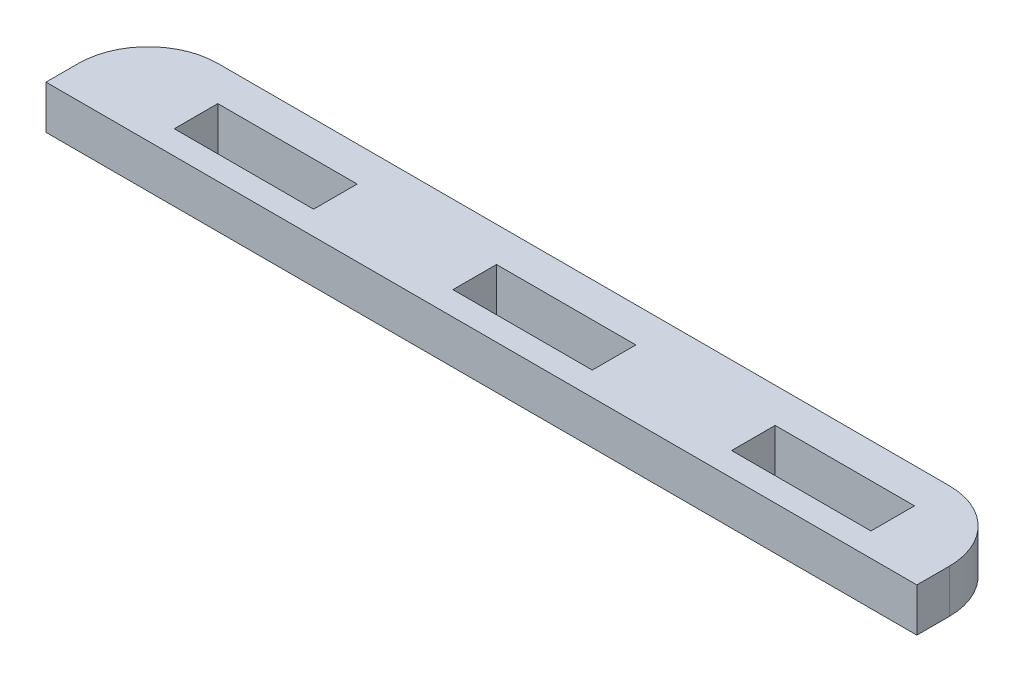
ISO-10303-21;
HEADER;
FILE_DESCRIPTION(('STEP AP214'),'2;1');
FILE_NAME('part.step','',(''),(''),'','','');
FILE_SCHEMA(('AUTOMOTIVE_DESIGN { 1 0 10303 214 1 1 1 1 }'));
ENDSEC;
DATA;
#1=APPLICATION_CONTEXT('core data for automotive mechanical design processes');
#2=APPLICATION_PROTOCOL_DEFINITION('international standard','automotive_design',2000,#1);
#3=PRODUCT_CONTEXT('',#1,'mechanical');
#4=PRODUCT('Part','Part','',(#3));
#5=PRODUCT_RELATED_PRODUCT_CATEGORY('part','',(#4));
#6=PRODUCT_DEFINITION_FORMATION('','',#4);
#7=PRODUCT_DEFINITION_CONTEXT('part definition',#1,'design');
#8=PRODUCT_DEFINITION('design','',#6,#7);
#9=PRODUCT_DEFINITION_SHAPE('','',#8);
#10=(LENGTH_UNIT() NAMED_UNIT(*) SI_UNIT(.MILLI.,.METRE.));
#11=(NAMED_UNIT(*) PLANE_ANGLE_UNIT() SI_UNIT($,.RADIAN.));
#12=(NAMED_UNIT(*) SI_UNIT($,.STERADIAN.) SOLID_ANGLE_UNIT());
#13=UNCERTAINTY_MEASURE_WITH_UNIT(LENGTH_MEASURE(1.E-05),#10,'distance_accuracy_value','');
#14=(GEOMETRIC_REPRESENTATION_CONTEXT(3) GLOBAL_UNCERTAINTY_ASSIGNED_CONTEXT((#13)) GLOBAL_UNIT_ASSIGNED_CONTEXT((#10,
#11,#12)) REPRESENTATION_CONTEXT('',''));
#15=CARTESIAN_POINT('',(0.,0.,0.));
#16=DIRECTION('',(0.,0.,1.));
#17=DIRECTION('',(1.,0.,0.));
#18=AXIS2_PLACEMENT_3D('',#15,#16,#17);
#19=CARTESIAN_POINT('',(31.75,3.175,15.113));
#20=DIRECTION('',(0.,-1.,0.));
#21=DIRECTION('',(0.,0.,-1.));
#22=AXIS2_PLACEMENT_3D('',#19,#20,#21);
#23=PLANE('',#22);
#24=DIRECTION('',(0.,0.,1.));
#25=VECTOR('',#24,1.);
#26=CARTESIAN_POINT('',(-24.13,3.175,-15.7479999999997));
#27=LINE('',#26,#25);
#28=CARTESIAN_POINT('',(-24.13,3.175,-15.7479999999997));
#29=VERTEX_POINT('',#28);
#30=CARTESIAN_POINT('',(-24.13,3.175,-12.5729999999997));
#31=VERTEX_POINT('',#30);
#32=EDGE_CURVE('E221',#29,#31,#27,.T.);
#33=ORIENTED_EDGE('',*,*,#32,.F.);
#34=DIRECTION('',(-1.,0.,0.));
#35=VECTOR('',#34,1.);
#36=CARTESIAN_POINT('',(-13.97,3.175,-15.7479999999997));
#37=LINE('',#36,#35);
#38=CARTESIAN_POINT('',(-13.97,3.175,-15.7479999999997));
#39=VERTEX_POINT('',#38);
#40=EDGE_CURVE('E229',#39,#29,#37,.T.);
#41=ORIENTED_EDGE('',*,*,#40,.F.);
#42=DIRECTION('',(0.,0.,-1.));
#43=VECTOR('',#42,1.);
#44=CARTESIAN_POINT('',(-13.97,3.175,-15.7479999999997));
#45=LINE('',#44,#43);
#46=CARTESIAN_POINT('',(-13.97,3.175,-12.5729999999997));
#47=VERTEX_POINT('',#46);
#48=EDGE_CURVE('E226',#47,#39,#45,.T.);
#49=ORIENTED_EDGE('',*,*,#48,.F.);
#50=DIRECTION('',(1.,0.,0.));
#51=VECTOR('',#50,1.);
#52=CARTESIAN_POINT('',(-13.97,3.175,-12.5729999999997));
#53=LINE('',#52,#51);
#54=EDGE_CURVE('E223',#31,#47,#53,.T.);
#55=ORIENTED_EDGE('',*,*,#54,.F.);
#56=EDGE_LOOP('',(#33,#41,#49,#55));
#57=FACE_BOUND('',#56,.T.);
#58=DIRECTION('',(0.,0.,1.));
#59=VECTOR('',#58,1.);
#60=CARTESIAN_POINT('',(16.51,3.175,-15.748));
#61=LINE('',#60,#59);
#62=CARTESIAN_POINT('',(16.51,3.175,-15.748));
#63=VERTEX_POINT('',#62);
#64=CARTESIAN_POINT('',(16.51,3.175,-12.573));
#65=VERTEX_POINT('',#64);
#66=EDGE_CURVE('E283',#63,#65,#61,.T.);
#67=ORIENTED_EDGE('',*,*,#66,.F.);
#68=DIRECTION('',(-1.,0.,0.));
#69=VECTOR('',#68,1.);
#70=CARTESIAN_POINT('',(26.67,3.175,-15.748));
#71=LINE('',#70,#69);
#72=CARTESIAN_POINT('',(26.67,3.175,-15.748));
#73=VERTEX_POINT('',#72);
#74=EDGE_CURVE('E291',#73,#63,#71,.T.);
#75=ORIENTED_EDGE('',*,*,#74,.F.);
#76=DIRECTION('',(0.,0.,-1.));
#77=VECTOR('',#76,1.);
#78=CARTESIAN_POINT('',(26.67,3.175,-15.748));
#79=LINE('',#78,#77);
#80=CARTESIAN_POINT('',(26.67,3.175,-12.573));
#81=VERTEX_POINT('',#80);
#82=EDGE_CURVE('E288',#81,#73,#79,.T.);
#83=ORIENTED_EDGE('',*,*,#82,.F.);
#84=DIRECTION('',(1.,0.,0.));
#85=VECTOR('',#84,1.);
#86=CARTESIAN_POINT('',(26.67,3.175,-12.573));
#87=LINE('',#86,#85);
#88=EDGE_CURVE('E285',#65,#81,#87,.T.);
#89=ORIENTED_EDGE('',*,*,#88,.F.);
#90=EDGE_LOOP('',(#67,#75,#83,#89));
#91=FACE_BOUND('',#90,.T.);
#92=DIRECTION('',(0.,0.,1.));
#93=VECTOR('',#92,1.);
#94=CARTESIAN_POINT('',(-31.75,3.175,-18.288));
#95=LINE('',#94,#93);
#96=CARTESIAN_POINT('',(-31.75,3.175,-13.208));
#97=VERTEX_POINT('',#96);
#98=CARTESIAN_POINT('',(-31.75,3.175,-10.8415929515944));
#99=VERTEX_POINT('',#98);
#100=EDGE_CURVE('E174',#97,#99,#95,.T.);
#101=ORIENTED_EDGE('',*,*,#100,.T.);
#102=DIRECTION('',(-1.,0.,0.));
#103=VECTOR('',#102,1.);
#104=CARTESIAN_POINT('',(-34.8908139368271,3.175,-10.8415929515944));
#105=LINE('',#104,#103);
#106=CARTESIAN_POINT('',(31.75,3.175,-10.8415929515944));
#107=VERTEX_POINT('',#106);
#108=EDGE_CURVE('E53',#107,#99,#105,.T.);
#109=ORIENTED_EDGE('',*,*,#108,.F.);
#110=DIRECTION('',(0.,0.,-1.));
#111=VECTOR('',#110,1.);
#112=CARTESIAN_POINT('',(31.75,3.175,-18.288));
#113=LINE('',#112,#111);
#114=CARTESIAN_POINT('',(31.75,3.175,-13.208));
#115=VERTEX_POINT('',#114);
#116=EDGE_CURVE('E172',#107,#115,#113,.T.);
#117=ORIENTED_EDGE('',*,*,#116,.T.);
#118=CARTESIAN_POINT('',(26.67,3.175,-13.208));
#119=DIRECTION('',(0.,-1.,0.));
#120=DIRECTION('',(0.,0.,-1.));
#121=AXIS2_PLACEMENT_3D('',#118,#119,#120);
#122=CIRCLE('',#121,5.08);
#123=CARTESIAN_POINT('',(26.67,3.175,-18.288));
#124=VERTEX_POINT('',#123);
#125=EDGE_CURVE('E208',#115,#124,#122,.F.);
#126=ORIENTED_EDGE('',*,*,#125,.T.);
#127=DIRECTION('',(-1.,0.,0.));
#128=VECTOR('',#127,1.);
#129=CARTESIAN_POINT('',(31.75,3.175,-18.288));
#130=LINE('',#129,#128);
#131=CARTESIAN_POINT('',(-26.67,3.175,-18.288));
#132=VERTEX_POINT('',#131);
#133=EDGE_CURVE('E180',#124,#132,#130,.T.);
#134=ORIENTED_EDGE('',*,*,#133,.T.);
#135=CARTESIAN_POINT('',(-26.67,3.175,-13.208));
#136=DIRECTION('',(0.,-1.,0.));
#137=DIRECTION('',(0.,0.,-1.));
#138=AXIS2_PLACEMENT_3D('',#135,#136,#137);
#139=CIRCLE('',#138,5.08);
#140=EDGE_CURVE('E60',#132,#97,#139,.F.);
#141=ORIENTED_EDGE('',*,*,#140,.T.);
#142=EDGE_LOOP('',(#101,#109,#117,#126,#134,#141));
#143=FACE_BOUND('',#142,.T.);
#144=DIRECTION('',(0.,0.,1.));
#145=VECTOR('',#144,1.);
#146=CARTESIAN_POINT('',(-3.81,3.175,-15.7479999999999));
#147=LINE('',#146,#145);
#148=CARTESIAN_POINT('',(-3.81,3.175,-15.7479999999999));
#149=VERTEX_POINT('',#148);
#150=CARTESIAN_POINT('',(-3.81,3.175,-12.5729999999999));
#151=VERTEX_POINT('',#150);
#152=EDGE_CURVE('E252',#149,#151,#147,.T.);
#153=ORIENTED_EDGE('',*,*,#152,.F.);
#154=DIRECTION('',(-1.,0.,0.));
#155=VECTOR('',#154,1.);
#156=CARTESIAN_POINT('',(6.35,3.175,-15.7479999999999));
#157=LINE('',#156,#155);
#158=CARTESIAN_POINT('',(6.34999999999999,3.175,-15.7479999999999));
#159=VERTEX_POINT('',#158);
#160=EDGE_CURVE('E260',#159,#149,#157,.T.);
#161=ORIENTED_EDGE('',*,*,#160,.F.);
#162=DIRECTION('',(0.,0.,-1.));
#163=VECTOR('',#162,1.);
#164=CARTESIAN_POINT('',(6.35,3.175,-15.7479999999999));
#165=LINE('',#164,#163);
#166=CARTESIAN_POINT('',(6.35,3.175,-12.5729999999999));
#167=VERTEX_POINT('',#166);
#168=EDGE_CURVE('E257',#167,#159,#165,.T.);
#169=ORIENTED_EDGE('',*,*,#168,.F.);
#170=DIRECTION('',(1.,0.,0.));
#171=VECTOR('',#170,1.);
#172=CARTESIAN_POINT('',(6.35,3.175,-12.5729999999999));
#173=LINE('',#172,#171);
#174=EDGE_CURVE('E254',#151,#167,#173,.T.);
#175=ORIENTED_EDGE('',*,*,#174,.F.);
#176=EDGE_LOOP('',(#153,#161,#169,#175));
#177=FACE_BOUND('',#176,.T.);
#178=ADVANCED_FACE('F38',(#57,#91,#143,#177),#23,.F.);
#179=CARTESIAN_POINT('',(31.75,0.,15.113));
#180=DIRECTION('',(0.,-1.,0.));
#181=DIRECTION('',(0.,0.,-1.));
#182=AXIS2_PLACEMENT_3D('',#179,#180,#181);
#183=PLANE('',#182);
#184=DIRECTION('',(-1.,0.,0.));
#185=VECTOR('',#184,1.);
#186=CARTESIAN_POINT('',(-34.8908139368271,0.,-10.8415929515944));
#187=LINE('',#186,#185);
#188=CARTESIAN_POINT('',(31.75,0.,-10.8415929515944));
#189=VERTEX_POINT('',#188);
#190=CARTESIAN_POINT('',(-31.75,0.,-10.8415929515944));
#191=VERTEX_POINT('',#190);
#192=EDGE_CURVE('E165',#189,#191,#187,.T.);
#193=ORIENTED_EDGE('',*,*,#192,.T.);
#194=DIRECTION('',(0.,0.,1.));
#195=VECTOR('',#194,1.);
#196=CARTESIAN_POINT('',(-31.75,0.,-18.288));
#197=LINE('',#196,#195);
#198=CARTESIAN_POINT('',(-31.75,0.,-13.208));
#199=VERTEX_POINT('',#198);
#200=EDGE_CURVE('E181',#199,#191,#197,.T.);
#201=ORIENTED_EDGE('',*,*,#200,.F.);
#202=CARTESIAN_POINT('',(-26.67,0.,-13.208));
#203=DIRECTION('',(0.,-1.,0.));
#204=DIRECTION('',(0.,0.,-1.));
#205=AXIS2_PLACEMENT_3D('',#202,#203,#204);
#206=CIRCLE('',#205,5.08);
#207=CARTESIAN_POINT('',(-26.67,0.,-18.288));
#208=VERTEX_POINT('',#207);
#209=EDGE_CURVE('E201',#199,#208,#206,.T.);
#210=ORIENTED_EDGE('',*,*,#209,.T.);
#211=DIRECTION('',(-1.,0.,0.));
#212=VECTOR('',#211,1.);
#213=CARTESIAN_POINT('',(31.75,0.,-18.288));
#214=LINE('',#213,#212);
#215=CARTESIAN_POINT('',(26.67,0.,-18.288));
#216=VERTEX_POINT('',#215);
#217=EDGE_CURVE('E185',#216,#208,#214,.T.);
#218=ORIENTED_EDGE('',*,*,#217,.F.);
#219=CARTESIAN_POINT('',(26.67,0.,-13.208));
#220=DIRECTION('',(0.,-1.,0.));
#221=DIRECTION('',(0.,0.,-1.));
#222=AXIS2_PLACEMENT_3D('',#219,#220,#221);
#223=CIRCLE('',#222,5.08);
#224=CARTESIAN_POINT('',(31.75,0.,-13.208));
#225=VERTEX_POINT('',#224);
#226=EDGE_CURVE('E203',#216,#225,#223,.T.);
#227=ORIENTED_EDGE('',*,*,#226,.T.);
#228=DIRECTION('',(0.,0.,-1.));
#229=VECTOR('',#228,1.);
#230=CARTESIAN_POINT('',(31.75,0.,-18.288));
#231=LINE('',#230,#229);
#232=EDGE_CURVE('E193',#189,#225,#231,.T.);
#233=ORIENTED_EDGE('',*,*,#232,.F.);
#234=EDGE_LOOP('',(#193,#201,#210,#218,#227,#233));
#235=FACE_BOUND('',#234,.T.);
#236=DIRECTION('',(-1.,0.,0.));
#237=VECTOR('',#236,1.);
#238=CARTESIAN_POINT('',(26.67,0.,-15.748));
#239=LINE('',#238,#237);
#240=CARTESIAN_POINT('',(26.67,0.,-15.748));
#241=VERTEX_POINT('',#240);
#242=CARTESIAN_POINT('',(16.51,0.,-15.748));
#243=VERTEX_POINT('',#242);
#244=EDGE_CURVE('E286',#241,#243,#239,.T.);
#245=ORIENTED_EDGE('',*,*,#244,.T.);
#246=DIRECTION('',(0.,0.,1.));
#247=VECTOR('',#246,1.);
#248=CARTESIAN_POINT('',(16.51,0.,-15.748));
#249=LINE('',#248,#247);
#250=CARTESIAN_POINT('',(16.51,0.,-12.573));
#251=VERTEX_POINT('',#250);
#252=EDGE_CURVE('E282',#243,#251,#249,.T.);
#253=ORIENTED_EDGE('',*,*,#252,.T.);
#254=DIRECTION('',(1.,0.,0.));
#255=VECTOR('',#254,1.);
#256=CARTESIAN_POINT('',(26.67,0.,-12.573));
#257=LINE('',#256,#255);
#258=CARTESIAN_POINT('',(26.67,0.,-12.573));
#259=VERTEX_POINT('',#258);
#260=EDGE_CURVE('E296',#251,#259,#257,.T.);
#261=ORIENTED_EDGE('',*,*,#260,.T.);
#262=DIRECTION('',(0.,0.,-1.));
#263=VECTOR('',#262,1.);
#264=CARTESIAN_POINT('',(26.67,0.,-15.748));
#265=LINE('',#264,#263);
#266=EDGE_CURVE('E299',#259,#241,#265,.T.);
#267=ORIENTED_EDGE('',*,*,#266,.T.);
#268=EDGE_LOOP('',(#245,#253,#261,#267));
#269=FACE_BOUND('',#268,.T.);
#270=DIRECTION('',(-1.,0.,0.));
#271=VECTOR('',#270,1.);
#272=CARTESIAN_POINT('',(6.35,0.,-15.7479999999999));
#273=LINE('',#272,#271);
#274=CARTESIAN_POINT('',(6.35,0.,-15.7479999999999));
#275=VERTEX_POINT('',#274);
#276=CARTESIAN_POINT('',(-3.81,0.,-15.7479999999999));
#277=VERTEX_POINT('',#276);
#278=EDGE_CURVE('E255',#275,#277,#273,.T.);
#279=ORIENTED_EDGE('',*,*,#278,.T.);
#280=DIRECTION('',(0.,0.,1.));
#281=VECTOR('',#280,1.);
#282=CARTESIAN_POINT('',(-3.81,0.,-15.7479999999999));
#283=LINE('',#282,#281);
#284=CARTESIAN_POINT('',(-3.81,0.,-12.5729999999999));
#285=VERTEX_POINT('',#284);
#286=EDGE_CURVE('E251',#277,#285,#283,.T.);
#287=ORIENTED_EDGE('',*,*,#286,.T.);
#288=DIRECTION('',(1.,0.,0.));
#289=VECTOR('',#288,1.);
#290=CARTESIAN_POINT('',(6.35,0.,-12.5729999999999));
#291=LINE('',#290,#289);
#292=CARTESIAN_POINT('',(6.35,0.,-12.5729999999999));
#293=VERTEX_POINT('',#292);
#294=EDGE_CURVE('E265',#285,#293,#291,.T.);
#295=ORIENTED_EDGE('',*,*,#294,.T.);
#296=DIRECTION('',(0.,0.,-1.));
#297=VECTOR('',#296,1.);
#298=CARTESIAN_POINT('',(6.35,0.,-15.7479999999999));
#299=LINE('',#298,#297);
#300=EDGE_CURVE('E268',#293,#275,#299,.T.);
#301=ORIENTED_EDGE('',*,*,#300,.T.);
#302=EDGE_LOOP('',(#279,#287,#295,#301));
#303=FACE_BOUND('',#302,.T.);
#304=DIRECTION('',(-1.,0.,0.));
#305=VECTOR('',#304,1.);
#306=CARTESIAN_POINT('',(-13.97,0.,-15.7479999999997));
#307=LINE('',#306,#305);
#308=CARTESIAN_POINT('',(-13.97,0.,-15.7479999999997));
#309=VERTEX_POINT('',#308);
#310=CARTESIAN_POINT('',(-24.13,0.,-15.7479999999997));
#311=VERTEX_POINT('',#310);
#312=EDGE_CURVE('E224',#309,#311,#307,.T.);
#313=ORIENTED_EDGE('',*,*,#312,.T.);
#314=DIRECTION('',(0.,0.,1.));
#315=VECTOR('',#314,1.);
#316=CARTESIAN_POINT('',(-24.13,0.,-15.7479999999997));
#317=LINE('',#316,#315);
#318=CARTESIAN_POINT('',(-24.13,0.,-12.5729999999997));
#319=VERTEX_POINT('',#318);
#320=EDGE_CURVE('E169',#311,#319,#317,.T.);
#321=ORIENTED_EDGE('',*,*,#320,.T.);
#322=DIRECTION('',(1.,0.,0.));
#323=VECTOR('',#322,1.);
#324=CARTESIAN_POINT('',(-13.97,0.,-12.5729999999997));
#325=LINE('',#324,#323);
#326=CARTESIAN_POINT('',(-13.97,0.,-12.5729999999997));
#327=VERTEX_POINT('',#326);
#328=EDGE_CURVE('E234',#319,#327,#325,.T.);
#329=ORIENTED_EDGE('',*,*,#328,.T.);
#330=DIRECTION('',(0.,0.,-1.));
#331=VECTOR('',#330,1.);
#332=CARTESIAN_POINT('',(-13.97,0.,-15.7479999999997));
#333=LINE('',#332,#331);
#334=EDGE_CURVE('E237',#327,#309,#333,.T.);
#335=ORIENTED_EDGE('',*,*,#334,.T.);
#336=EDGE_LOOP('',(#313,#321,#329,#335));
#337=FACE_BOUND('',#336,.T.);
#338=ADVANCED_FACE('F216',(#235,#269,#303,#337),#183,.T.);
#339=CARTESIAN_POINT('',(31.75,3.175,-18.288));
#340=DIRECTION('',(-1.,0.,0.));
#341=DIRECTION('',(0.,0.,1.));
#342=AXIS2_PLACEMENT_3D('',#339,#340,#341);
#343=PLANE('',#342);
#344=ORIENTED_EDGE('',*,*,#116,.F.);
#345=DIRECTION('',(0.,-1.,0.));
#346=VECTOR('',#345,1.);
#347=CARTESIAN_POINT('',(31.75,3.175,-10.8415929515944));
#348=LINE('',#347,#346);
#349=EDGE_CURVE('E162',#107,#189,#348,.T.);
#350=ORIENTED_EDGE('',*,*,#349,.T.);
#351=ORIENTED_EDGE('',*,*,#232,.T.);
#352=DIRECTION('',(0.,-1.,0.));
#353=VECTOR('',#352,1.);
#354=CARTESIAN_POINT('',(31.75,3.175,-13.208));
#355=LINE('',#354,#353);
#356=EDGE_CURVE('E178',#225,#115,#355,.F.);
#357=ORIENTED_EDGE('',*,*,#356,.T.);
#358=EDGE_LOOP('',(#344,#350,#351,#357));
#359=FACE_BOUND('',#358,.T.);
#360=ADVANCED_FACE('F176',(#359),#343,.F.);
#361=CARTESIAN_POINT('',(31.75,3.175,-18.288));
#362=DIRECTION('',(0.,0.,1.));
#363=DIRECTION('',(1.,0.,0.));
#364=AXIS2_PLACEMENT_3D('',#361,#362,#363);
#365=PLANE('',#364);
#366=ORIENTED_EDGE('',*,*,#133,.F.);
#367=DIRECTION('',(0.,-1.,0.));
#368=VECTOR('',#367,1.);
#369=CARTESIAN_POINT('',(26.67,3.175,-18.288));
#370=LINE('',#369,#368);
#371=EDGE_CURVE('E198',#124,#216,#370,.T.);
#372=ORIENTED_EDGE('',*,*,#371,.T.);
#373=ORIENTED_EDGE('',*,*,#217,.T.);
#374=DIRECTION('',(0.,-1.,0.));
#375=VECTOR('',#374,1.);
#376=CARTESIAN_POINT('',(-26.67,3.175,-18.288));
#377=LINE('',#376,#375);
#378=EDGE_CURVE('E192',#208,#132,#377,.F.);
#379=ORIENTED_EDGE('',*,*,#378,.T.);
#380=EDGE_LOOP('',(#366,#372,#373,#379));
#381=FACE_BOUND('',#380,.T.);
#382=ADVANCED_FACE('F349',(#381),#365,.F.);
#383=CARTESIAN_POINT('',(-31.75,3.175,-18.288));
#384=DIRECTION('',(1.,0.,0.));
#385=DIRECTION('',(0.,0.,-1.));
#386=AXIS2_PLACEMENT_3D('',#383,#384,#385);
#387=PLANE('',#386);
#388=ORIENTED_EDGE('',*,*,#200,.T.);
#389=DIRECTION('',(0.,1.,0.));
#390=VECTOR('',#389,1.);
#391=CARTESIAN_POINT('',(-31.75,3.175,-10.8415929515944));
#392=LINE('',#391,#390);
#393=EDGE_CURVE('E11',#191,#99,#392,.T.);
#394=ORIENTED_EDGE('',*,*,#393,.T.);
#395=ORIENTED_EDGE('',*,*,#100,.F.);
#396=DIRECTION('',(0.,-1.,0.));
#397=VECTOR('',#396,1.);
#398=CARTESIAN_POINT('',(-31.75,3.175,-13.208));
#399=LINE('',#398,#397);
#400=EDGE_CURVE('E46',#97,#199,#399,.T.);
#401=ORIENTED_EDGE('',*,*,#400,.T.);
#402=EDGE_LOOP('',(#388,#394,#395,#401));
#403=FACE_BOUND('',#402,.T.);
#404=ADVANCED_FACE('F213',(#403),#387,.F.);
#405=CARTESIAN_POINT('',(16.51,3.175,-15.748));
#406=DIRECTION('',(1.,0.,0.));
#407=DIRECTION('',(0.,0.,-1.));
#408=AXIS2_PLACEMENT_3D('',#405,#406,#407);
#409=PLANE('',#408);
#410=ORIENTED_EDGE('',*,*,#252,.F.);
#411=DIRECTION('',(0.,-1.,0.));
#412=VECTOR('',#411,1.);
#413=CARTESIAN_POINT('',(16.51,3.175,-15.748));
#414=LINE('',#413,#412);
#415=EDGE_CURVE('E293',#63,#243,#414,.T.);
#416=ORIENTED_EDGE('',*,*,#415,.F.);
#417=ORIENTED_EDGE('',*,*,#66,.T.);
#418=DIRECTION('',(0.,-1.,0.));
#419=VECTOR('',#418,1.);
#420=CARTESIAN_POINT('',(16.51,3.175,-12.573));
#421=LINE('',#420,#419);
#422=EDGE_CURVE('E188',#65,#251,#421,.T.);
#423=ORIENTED_EDGE('',*,*,#422,.T.);
#424=EDGE_LOOP('',(#410,#416,#417,#423));
#425=FACE_BOUND('',#424,.T.);
#426=ADVANCED_FACE('F314',(#425),#409,.T.);
#427=CARTESIAN_POINT('',(26.67,3.175,-12.573));
#428=DIRECTION('',(0.,0.,-1.));
#429=DIRECTION('',(-1.,0.,0.));
#430=AXIS2_PLACEMENT_3D('',#427,#428,#429);
#431=PLANE('',#430);
#432=ORIENTED_EDGE('',*,*,#260,.F.);
#433=ORIENTED_EDGE('',*,*,#422,.F.);
#434=ORIENTED_EDGE('',*,*,#88,.T.);
#435=DIRECTION('',(0.,-1.,0.));
#436=VECTOR('',#435,1.);
#437=CARTESIAN_POINT('',(26.67,3.175,-12.573));
#438=LINE('',#437,#436);
#439=EDGE_CURVE('E307',#81,#259,#438,.T.);
#440=ORIENTED_EDGE('',*,*,#439,.T.);
#441=EDGE_LOOP('',(#432,#433,#434,#440));
#442=FACE_BOUND('',#441,.T.);
#443=ADVANCED_FACE('F325',(#442),#431,.T.);
#444=CARTESIAN_POINT('',(26.67,3.175,-15.748));
#445=DIRECTION('',(-1.,0.,0.));
#446=DIRECTION('',(0.,0.,1.));
#447=AXIS2_PLACEMENT_3D('',#444,#445,#446);
#448=PLANE('',#447);
#449=ORIENTED_EDGE('',*,*,#266,.F.);
#450=ORIENTED_EDGE('',*,*,#439,.F.);
#451=ORIENTED_EDGE('',*,*,#82,.T.);
#452=DIRECTION('',(0.,-1.,0.));
#453=VECTOR('',#452,1.);
#454=CARTESIAN_POINT('',(26.67,3.175,-15.748));
#455=LINE('',#454,#453);
#456=EDGE_CURVE('E306',#73,#241,#455,.T.);
#457=ORIENTED_EDGE('',*,*,#456,.T.);
#458=EDGE_LOOP('',(#449,#450,#451,#457));
#459=FACE_BOUND('',#458,.T.);
#460=ADVANCED_FACE('F327',(#459),#448,.T.);
#461=CARTESIAN_POINT('',(26.67,3.175,-15.748));
#462=DIRECTION('',(0.,0.,1.));
#463=DIRECTION('',(1.,0.,0.));
#464=AXIS2_PLACEMENT_3D('',#461,#462,#463);
#465=PLANE('',#464);
#466=ORIENTED_EDGE('',*,*,#244,.F.);
#467=ORIENTED_EDGE('',*,*,#456,.F.);
#468=ORIENTED_EDGE('',*,*,#74,.T.);
#469=ORIENTED_EDGE('',*,*,#415,.T.);
#470=EDGE_LOOP('',(#466,#467,#468,#469));
#471=FACE_BOUND('',#470,.T.);
#472=ADVANCED_FACE('F321',(#471),#465,.T.);
#473=CARTESIAN_POINT('',(-3.81,3.175,-15.7479999999999));
#474=DIRECTION('',(1.,0.,0.));
#475=DIRECTION('',(0.,0.,-1.));
#476=AXIS2_PLACEMENT_3D('',#473,#474,#475);
#477=PLANE('',#476);
#478=ORIENTED_EDGE('',*,*,#286,.F.);
#479=DIRECTION('',(0.,-1.,0.));
#480=VECTOR('',#479,1.);
#481=CARTESIAN_POINT('',(-3.81,3.175,-15.7479999999999));
#482=LINE('',#481,#480);
#483=EDGE_CURVE('E262',#149,#277,#482,.T.);
#484=ORIENTED_EDGE('',*,*,#483,.F.);
#485=ORIENTED_EDGE('',*,*,#152,.T.);
#486=DIRECTION('',(0.,-1.,0.));
#487=VECTOR('',#486,1.);
#488=CARTESIAN_POINT('',(-3.81,3.175,-12.5729999999999));
#489=LINE('',#488,#487);
#490=EDGE_CURVE('E279',#151,#285,#489,.T.);
#491=ORIENTED_EDGE('',*,*,#490,.T.);
#492=EDGE_LOOP('',(#478,#484,#485,#491));
#493=FACE_BOUND('',#492,.T.);
#494=ADVANCED_FACE('F334',(#493),#477,.T.);
#495=CARTESIAN_POINT('',(6.35,3.175,-12.5729999999999));
#496=DIRECTION('',(0.,0.,-1.));
#497=DIRECTION('',(-1.,0.,0.));
#498=AXIS2_PLACEMENT_3D('',#495,#496,#497);
#499=PLANE('',#498);
#500=ORIENTED_EDGE('',*,*,#294,.F.);
#501=ORIENTED_EDGE('',*,*,#490,.F.);
#502=ORIENTED_EDGE('',*,*,#174,.T.);
#503=DIRECTION('',(0.,-1.,0.));
#504=VECTOR('',#503,1.);
#505=CARTESIAN_POINT('',(6.35,3.175,-12.5729999999999));
#506=LINE('',#505,#504);
#507=EDGE_CURVE('E277',#167,#293,#506,.T.);
#508=ORIENTED_EDGE('',*,*,#507,.T.);
#509=EDGE_LOOP('',(#500,#501,#502,#508));
#510=FACE_BOUND('',#509,.T.);
#511=ADVANCED_FACE('F391',(#510),#499,.T.);
#512=CARTESIAN_POINT('',(6.35,3.175,-15.7479999999999));
#513=DIRECTION('',(-1.,0.,0.));
#514=DIRECTION('',(0.,0.,1.));
#515=AXIS2_PLACEMENT_3D('',#512,#513,#514);
#516=PLANE('',#515);
#517=ORIENTED_EDGE('',*,*,#300,.F.);
#518=ORIENTED_EDGE('',*,*,#507,.F.);
#519=ORIENTED_EDGE('',*,*,#168,.T.);
#520=DIRECTION('',(0.,-1.,0.));
#521=VECTOR('',#520,1.);
#522=CARTESIAN_POINT('',(6.35,3.175,-15.7479999999999));
#523=LINE('',#522,#521);
#524=EDGE_CURVE('E275',#159,#275,#523,.T.);
#525=ORIENTED_EDGE('',*,*,#524,.T.);
#526=EDGE_LOOP('',(#517,#518,#519,#525));
#527=FACE_BOUND('',#526,.T.);
#528=ADVANCED_FACE('F387',(#527),#516,.T.);
#529=CARTESIAN_POINT('',(6.35,3.175,-15.7479999999999));
#530=DIRECTION('',(0.,0.,1.));
#531=DIRECTION('',(1.,0.,0.));
#532=AXIS2_PLACEMENT_3D('',#529,#530,#531);
#533=PLANE('',#532);
#534=ORIENTED_EDGE('',*,*,#278,.F.);
#535=ORIENTED_EDGE('',*,*,#524,.F.);
#536=ORIENTED_EDGE('',*,*,#160,.T.);
#537=ORIENTED_EDGE('',*,*,#483,.T.);
#538=EDGE_LOOP('',(#534,#535,#536,#537));
#539=FACE_BOUND('',#538,.T.);
#540=ADVANCED_FACE('F383',(#539),#533,.T.);
#541=CARTESIAN_POINT('',(-24.13,3.175,-15.7479999999997));
#542=DIRECTION('',(1.,0.,0.));
#543=DIRECTION('',(0.,0.,-1.));
#544=AXIS2_PLACEMENT_3D('',#541,#542,#543);
#545=PLANE('',#544);
#546=ORIENTED_EDGE('',*,*,#320,.F.);
#547=DIRECTION('',(0.,-1.,0.));
#548=VECTOR('',#547,1.);
#549=CARTESIAN_POINT('',(-24.13,3.175,-15.7479999999997));
#550=LINE('',#549,#548);
#551=EDGE_CURVE('E231',#29,#311,#550,.T.);
#552=ORIENTED_EDGE('',*,*,#551,.F.);
#553=ORIENTED_EDGE('',*,*,#32,.T.);
#554=DIRECTION('',(0.,-1.,0.));
#555=VECTOR('',#554,1.);
#556=CARTESIAN_POINT('',(-24.13,3.175,-12.5729999999997));
#557=LINE('',#556,#555);
#558=EDGE_CURVE('E248',#31,#319,#557,.T.);
#559=ORIENTED_EDGE('',*,*,#558,.T.);
#560=EDGE_LOOP('',(#546,#552,#553,#559));
#561=FACE_BOUND('',#560,.T.);
#562=ADVANCED_FACE('F379',(#561),#545,.T.);
#563=CARTESIAN_POINT('',(-13.97,3.175,-12.5729999999997));
#564=DIRECTION('',(0.,0.,-1.));
#565=DIRECTION('',(-1.,0.,0.));
#566=AXIS2_PLACEMENT_3D('',#563,#564,#565);
#567=PLANE('',#566);
#568=ORIENTED_EDGE('',*,*,#328,.F.);
#569=ORIENTED_EDGE('',*,*,#558,.F.);
#570=ORIENTED_EDGE('',*,*,#54,.T.);
#571=DIRECTION('',(0.,-1.,0.));
#572=VECTOR('',#571,1.);
#573=CARTESIAN_POINT('',(-13.97,3.175,-12.5729999999997));
#574=LINE('',#573,#572);
#575=EDGE_CURVE('E246',#47,#327,#574,.T.);
#576=ORIENTED_EDGE('',*,*,#575,.T.);
#577=EDGE_LOOP('',(#568,#569,#570,#576));
#578=FACE_BOUND('',#577,.T.);
#579=ADVANCED_FACE('F371',(#578),#567,.T.);
#580=CARTESIAN_POINT('',(-13.97,3.175,-15.7479999999997));
#581=DIRECTION('',(-1.,0.,0.));
#582=DIRECTION('',(0.,0.,1.));
#583=AXIS2_PLACEMENT_3D('',#580,#581,#582);
#584=PLANE('',#583);
#585=ORIENTED_EDGE('',*,*,#334,.F.);
#586=ORIENTED_EDGE('',*,*,#575,.F.);
#587=ORIENTED_EDGE('',*,*,#48,.T.);
#588=DIRECTION('',(0.,-1.,0.));
#589=VECTOR('',#588,1.);
#590=CARTESIAN_POINT('',(-13.97,3.175,-15.7479999999997));
#591=LINE('',#590,#589);
#592=EDGE_CURVE('E244',#39,#309,#591,.T.);
#593=ORIENTED_EDGE('',*,*,#592,.T.);
#594=EDGE_LOOP('',(#585,#586,#587,#593));
#595=FACE_BOUND('',#594,.T.);
#596=ADVANCED_FACE('F362',(#595),#584,.T.);
#597=CARTESIAN_POINT('',(-13.97,3.175,-15.7479999999997));
#598=DIRECTION('',(0.,0.,1.));
#599=DIRECTION('',(1.,0.,0.));
#600=AXIS2_PLACEMENT_3D('',#597,#598,#599);
#601=PLANE('',#600);
#602=ORIENTED_EDGE('',*,*,#312,.F.);
#603=ORIENTED_EDGE('',*,*,#592,.F.);
#604=ORIENTED_EDGE('',*,*,#40,.T.);
#605=ORIENTED_EDGE('',*,*,#551,.T.);
#606=EDGE_LOOP('',(#602,#603,#604,#605));
#607=FACE_BOUND('',#606,.T.);
#608=ADVANCED_FACE('F356',(#607),#601,.T.);
#609=CARTESIAN_POINT('',(26.67,3.175,-13.208));
#610=DIRECTION('',(0.,-1.,0.));
#611=DIRECTION('',(0.,0.,-1.));
#612=AXIS2_PLACEMENT_3D('',#609,#610,#611);
#613=CYLINDRICAL_SURFACE('',#612,5.08);
#614=ORIENTED_EDGE('',*,*,#125,.F.);
#615=ORIENTED_EDGE('',*,*,#356,.F.);
#616=ORIENTED_EDGE('',*,*,#226,.F.);
#617=ORIENTED_EDGE('',*,*,#371,.F.);
#618=EDGE_LOOP('',(#614,#615,#616,#617));
#619=FACE_BOUND('',#618,.T.);
#620=ADVANCED_FACE('F354',(#619),#613,.T.);
#621=CARTESIAN_POINT('',(-26.67,3.175,-13.208));
#622=DIRECTION('',(0.,-1.,0.));
#623=DIRECTION('',(0.,0.,-1.));
#624=AXIS2_PLACEMENT_3D('',#621,#622,#623);
#625=CYLINDRICAL_SURFACE('',#624,5.08);
#626=ORIENTED_EDGE('',*,*,#140,.F.);
#627=ORIENTED_EDGE('',*,*,#378,.F.);
#628=ORIENTED_EDGE('',*,*,#209,.F.);
#629=ORIENTED_EDGE('',*,*,#400,.F.);
#630=EDGE_LOOP('',(#626,#627,#628,#629));
#631=FACE_BOUND('',#630,.T.);
#632=ADVANCED_FACE('F40',(#631),#625,.T.);
#633=CARTESIAN_POINT('',(-34.8908139368271,0.,-10.8415929515944));
#634=DIRECTION('',(0.,0.,-1.));
#635=DIRECTION('',(-1.,0.,0.));
#636=AXIS2_PLACEMENT_3D('',#633,#634,#635);
#637=PLANE('',#636);
#638=ORIENTED_EDGE('',*,*,#108,.T.);
#639=ORIENTED_EDGE('',*,*,#393,.F.);
#640=ORIENTED_EDGE('',*,*,#192,.F.);
#641=ORIENTED_EDGE('',*,*,#349,.F.);
#642=EDGE_LOOP('',(#638,#639,#640,#641));
#643=FACE_BOUND('',#642,.T.);
#644=ADVANCED_FACE('F163',(#643),#637,.F.);
#645=CLOSED_SHELL('',(#178,#338,#360,#382,#404,#426,#443,#460,#472,#494,#511,#528,#540,#562,
#579,#596,#608,#620,#632,#644));
#646=MANIFOLD_SOLID_BREP('B2',#645);
#647=ADVANCED_BREP_SHAPE_REPRESENTATION('',(#18,#646),#14);
#648=SHAPE_DEFINITION_REPRESENTATION(#9,#647);
ENDSEC;
END-ISO-10303-21;
